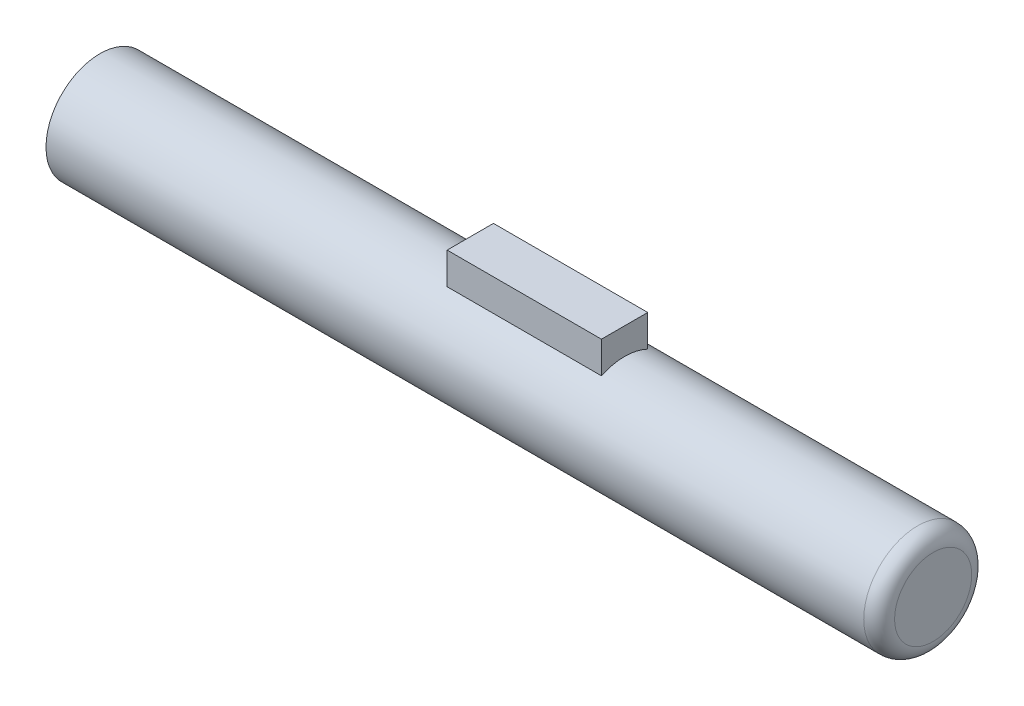
ISO-10303-21;
HEADER;
FILE_DESCRIPTION(('STEP AP214'),'2;1');
FILE_NAME('part.step','',(''),(''),'','','');
FILE_SCHEMA(('AUTOMOTIVE_DESIGN { 1 0 10303 214 1 1 1 1 }'));
ENDSEC;
DATA;
#1=APPLICATION_CONTEXT('core data for automotive mechanical design processes');
#2=APPLICATION_PROTOCOL_DEFINITION('international standard','automotive_design',2000,#1);
#3=PRODUCT_CONTEXT('',#1,'mechanical');
#4=PRODUCT('Part','Part','',(#3));
#5=PRODUCT_RELATED_PRODUCT_CATEGORY('part','',(#4));
#6=PRODUCT_DEFINITION_FORMATION('','',#4);
#7=PRODUCT_DEFINITION_CONTEXT('part definition',#1,'design');
#8=PRODUCT_DEFINITION('design','',#6,#7);
#9=PRODUCT_DEFINITION_SHAPE('','',#8);
#10=(LENGTH_UNIT() NAMED_UNIT(*) SI_UNIT(.MILLI.,.METRE.));
#11=(NAMED_UNIT(*) PLANE_ANGLE_UNIT() SI_UNIT($,.RADIAN.));
#12=(NAMED_UNIT(*) SI_UNIT($,.STERADIAN.) SOLID_ANGLE_UNIT());
#13=UNCERTAINTY_MEASURE_WITH_UNIT(LENGTH_MEASURE(1.E-05),#10,'distance_accuracy_value','');
#14=(GEOMETRIC_REPRESENTATION_CONTEXT(3) GLOBAL_UNCERTAINTY_ASSIGNED_CONTEXT((#13)) GLOBAL_UNIT_ASSIGNED_CONTEXT((#10,
#11,#12)) REPRESENTATION_CONTEXT('',''));
#15=CARTESIAN_POINT('',(0.,0.,0.));
#16=DIRECTION('',(0.,0.,1.));
#17=DIRECTION('',(1.,0.,0.));
#18=AXIS2_PLACEMENT_3D('',#15,#16,#17);
#19=CARTESIAN_POINT('',(0.,0.,0.));
#20=DIRECTION('',(-1.,0.,0.));
#21=DIRECTION('',(0.,0.,1.));
#22=AXIS2_PLACEMENT_3D('',#19,#20,#21);
#23=CYLINDRICAL_SURFACE('',#22,3.5);
#24=CARTESIAN_POINT('',(53.,0.,0.));
#25=DIRECTION('',(-1.,0.,0.));
#26=DIRECTION('',(0.,0.,1.));
#27=AXIS2_PLACEMENT_3D('',#24,#25,#26);
#28=CIRCLE('',#27,3.5);
#29=CARTESIAN_POINT('',(53.,0.,3.5));
#30=VERTEX_POINT('',#29);
#31=EDGE_CURVE('E48',#30,#30,#28,.T.);
#32=ORIENTED_EDGE('',*,*,#31,.T.);
#33=EDGE_LOOP('',(#32));
#34=FACE_BOUND('',#33,.T.);
#35=CARTESIAN_POINT('',(0.,0.,0.));
#36=DIRECTION('',(-1.,0.,0.));
#37=DIRECTION('',(0.,0.,1.));
#38=AXIS2_PLACEMENT_3D('',#35,#36,#37);
#39=CIRCLE('',#38,3.5);
#40=CARTESIAN_POINT('',(0.,0.,3.5));
#41=VERTEX_POINT('',#40);
#42=EDGE_CURVE('E127',#41,#41,#39,.T.);
#43=ORIENTED_EDGE('',*,*,#42,.F.);
#44=EDGE_LOOP('',(#43));
#45=FACE_BOUND('',#44,.T.);
#46=CARTESIAN_POINT('',(24.,0.,0.));
#47=DIRECTION('',(-1.,0.,0.));
#48=DIRECTION('',(0.,0.,-1.));
#49=AXIS2_PLACEMENT_3D('',#46,#47,#48);
#50=CIRCLE('',#49,3.5);
#51=CARTESIAN_POINT('',(24.,3.16227766016838,1.5));
#52=VERTEX_POINT('',#51);
#53=CARTESIAN_POINT('',(24.,3.16227766016838,-1.5));
#54=VERTEX_POINT('',#53);
#55=EDGE_CURVE('E85',#52,#54,#50,.T.);
#56=ORIENTED_EDGE('',*,*,#55,.T.);
#57=DIRECTION('',(1.,0.,0.));
#58=VECTOR('',#57,1.);
#59=CARTESIAN_POINT('',(24.,3.16227766016838,-1.5));
#60=LINE('',#59,#58);
#61=CARTESIAN_POINT('',(34.,3.16227766016838,-1.5));
#62=VERTEX_POINT('',#61);
#63=EDGE_CURVE('E90',#54,#62,#60,.T.);
#64=ORIENTED_EDGE('',*,*,#63,.T.);
#65=CARTESIAN_POINT('',(34.,0.,0.));
#66=DIRECTION('',(-1.,0.,0.));
#67=DIRECTION('',(0.,0.,-1.));
#68=AXIS2_PLACEMENT_3D('',#65,#66,#67);
#69=CIRCLE('',#68,3.5);
#70=CARTESIAN_POINT('',(34.,3.16227766016838,1.5));
#71=VERTEX_POINT('',#70);
#72=EDGE_CURVE('E118',#71,#62,#69,.T.);
#73=ORIENTED_EDGE('',*,*,#72,.F.);
#74=DIRECTION('',(1.,0.,0.));
#75=VECTOR('',#74,1.);
#76=CARTESIAN_POINT('',(24.,3.16227766016838,1.5));
#77=LINE('',#76,#75);
#78=EDGE_CURVE('E100',#52,#71,#77,.T.);
#79=ORIENTED_EDGE('',*,*,#78,.F.);
#80=EDGE_LOOP('',(#56,#64,#73,#79));
#81=FACE_BOUND('',#80,.T.);
#82=ADVANCED_FACE('F39',(#34,#45,#81),#23,.T.);
#83=CARTESIAN_POINT('',(0.,3.5,0.));
#84=DIRECTION('',(1.,0.,0.));
#85=DIRECTION('',(0.,0.,-1.));
#86=AXIS2_PLACEMENT_3D('',#83,#84,#85);
#87=PLANE('',#86);
#88=ORIENTED_EDGE('',*,*,#42,.T.);
#89=EDGE_LOOP('',(#88));
#90=FACE_BOUND('',#89,.T.);
#91=ADVANCED_FACE('F149',(#90),#87,.F.);
#92=CARTESIAN_POINT('',(54.,0.,0.));
#93=DIRECTION('',(-1.,0.,0.));
#94=DIRECTION('',(0.,0.,1.));
#95=AXIS2_PLACEMENT_3D('',#92,#93,#94);
#96=PLANE('',#95);
#97=CARTESIAN_POINT('',(54.,0.,0.));
#98=DIRECTION('',(-1.,0.,0.));
#99=DIRECTION('',(0.,0.,1.));
#100=AXIS2_PLACEMENT_3D('',#97,#98,#99);
#101=CIRCLE('',#100,2.5);
#102=CARTESIAN_POINT('',(54.,0.,2.5));
#103=VERTEX_POINT('',#102);
#104=EDGE_CURVE('E11',#103,#103,#101,.F.);
#105=ORIENTED_EDGE('',*,*,#104,.T.);
#106=EDGE_LOOP('',(#105));
#107=FACE_BOUND('',#106,.T.);
#108=ADVANCED_FACE('F154',(#107),#96,.F.);
#109=CARTESIAN_POINT('',(24.,5.22,1.5));
#110=DIRECTION('',(0.,0.,1.));
#111=DIRECTION('',(1.,0.,0.));
#112=AXIS2_PLACEMENT_3D('',#109,#110,#111);
#113=PLANE('',#112);
#114=DIRECTION('',(0.,-1.,0.));
#115=VECTOR('',#114,1.);
#116=CARTESIAN_POINT('',(34.,5.22,1.5));
#117=LINE('',#116,#115);
#118=CARTESIAN_POINT('',(34.,5.22,1.5));
#119=VERTEX_POINT('',#118);
#120=EDGE_CURVE('E55',#119,#71,#117,.T.);
#121=ORIENTED_EDGE('',*,*,#120,.F.);
#122=DIRECTION('',(1.,0.,0.));
#123=VECTOR('',#122,1.);
#124=CARTESIAN_POINT('',(24.,5.22,1.5));
#125=LINE('',#124,#123);
#126=CARTESIAN_POINT('',(24.,5.22,1.5));
#127=VERTEX_POINT('',#126);
#128=EDGE_CURVE('E63',#127,#119,#125,.T.);
#129=ORIENTED_EDGE('',*,*,#128,.F.);
#130=DIRECTION('',(0.,-1.,0.));
#131=VECTOR('',#130,1.);
#132=CARTESIAN_POINT('',(24.,5.22,1.5));
#133=LINE('',#132,#131);
#134=EDGE_CURVE('E108',#127,#52,#133,.T.);
#135=ORIENTED_EDGE('',*,*,#134,.T.);
#136=ORIENTED_EDGE('',*,*,#78,.T.);
#137=EDGE_LOOP('',(#121,#129,#135,#136));
#138=FACE_BOUND('',#137,.T.);
#139=ADVANCED_FACE('F158',(#138),#113,.T.);
#140=CARTESIAN_POINT('',(24.,5.22,1.5));
#141=DIRECTION('',(0.,1.,0.));
#142=DIRECTION('',(0.,0.,1.));
#143=AXIS2_PLACEMENT_3D('',#140,#141,#142);
#144=PLANE('',#143);
#145=DIRECTION('',(0.,0.,1.));
#146=VECTOR('',#145,1.);
#147=CARTESIAN_POINT('',(34.,5.22,1.5));
#148=LINE('',#147,#146);
#149=CARTESIAN_POINT('',(34.,5.22,-1.5));
#150=VERTEX_POINT('',#149);
#151=EDGE_CURVE('E111',#150,#119,#148,.T.);
#152=ORIENTED_EDGE('',*,*,#151,.F.);
#153=DIRECTION('',(1.,0.,0.));
#154=VECTOR('',#153,1.);
#155=CARTESIAN_POINT('',(24.,5.22,-1.5));
#156=LINE('',#155,#154);
#157=CARTESIAN_POINT('',(24.,5.22,-1.5));
#158=VERTEX_POINT('',#157);
#159=EDGE_CURVE('E99',#158,#150,#156,.T.);
#160=ORIENTED_EDGE('',*,*,#159,.F.);
#161=DIRECTION('',(0.,0.,1.));
#162=VECTOR('',#161,1.);
#163=CARTESIAN_POINT('',(24.,5.22,1.5));
#164=LINE('',#163,#162);
#165=EDGE_CURVE('E103',#158,#127,#164,.T.);
#166=ORIENTED_EDGE('',*,*,#165,.T.);
#167=ORIENTED_EDGE('',*,*,#128,.T.);
#168=EDGE_LOOP('',(#152,#160,#166,#167));
#169=FACE_BOUND('',#168,.T.);
#170=ADVANCED_FACE('F165',(#169),#144,.T.);
#171=CARTESIAN_POINT('',(24.,5.22,-1.5));
#172=DIRECTION('',(0.,0.,-1.));
#173=DIRECTION('',(-1.,0.,0.));
#174=AXIS2_PLACEMENT_3D('',#171,#172,#173);
#175=PLANE('',#174);
#176=DIRECTION('',(0.,1.,0.));
#177=VECTOR('',#176,1.);
#178=CARTESIAN_POINT('',(34.,5.22,-1.5));
#179=LINE('',#178,#177);
#180=EDGE_CURVE('E95',#62,#150,#179,.T.);
#181=ORIENTED_EDGE('',*,*,#180,.F.);
#182=ORIENTED_EDGE('',*,*,#63,.F.);
#183=DIRECTION('',(0.,1.,0.));
#184=VECTOR('',#183,1.);
#185=CARTESIAN_POINT('',(24.,5.22,-1.5));
#186=LINE('',#185,#184);
#187=EDGE_CURVE('E92',#54,#158,#186,.T.);
#188=ORIENTED_EDGE('',*,*,#187,.T.);
#189=ORIENTED_EDGE('',*,*,#159,.T.);
#190=EDGE_LOOP('',(#181,#182,#188,#189));
#191=FACE_BOUND('',#190,.T.);
#192=ADVANCED_FACE('F91',(#191),#175,.T.);
#193=CARTESIAN_POINT('',(24.,0.,0.));
#194=DIRECTION('',(1.,0.,0.));
#195=DIRECTION('',(0.,0.,-1.));
#196=AXIS2_PLACEMENT_3D('',#193,#194,#195);
#197=PLANE('',#196);
#198=ORIENTED_EDGE('',*,*,#134,.F.);
#199=ORIENTED_EDGE('',*,*,#165,.F.);
#200=ORIENTED_EDGE('',*,*,#187,.F.);
#201=ORIENTED_EDGE('',*,*,#55,.F.);
#202=EDGE_LOOP('',(#198,#199,#200,#201));
#203=FACE_BOUND('',#202,.T.);
#204=ADVANCED_FACE('F102',(#203),#197,.F.);
#205=CARTESIAN_POINT('',(34.,0.,0.));
#206=DIRECTION('',(1.,0.,0.));
#207=DIRECTION('',(0.,0.,-1.));
#208=AXIS2_PLACEMENT_3D('',#205,#206,#207);
#209=PLANE('',#208);
#210=ORIENTED_EDGE('',*,*,#120,.T.);
#211=ORIENTED_EDGE('',*,*,#72,.T.);
#212=ORIENTED_EDGE('',*,*,#180,.T.);
#213=ORIENTED_EDGE('',*,*,#151,.T.);
#214=EDGE_LOOP('',(#210,#211,#212,#213));
#215=FACE_BOUND('',#214,.T.);
#216=ADVANCED_FACE('F141',(#215),#209,.T.);
#217=CARTESIAN_POINT('',(53.,0.,0.));
#218=DIRECTION('',(-1.,0.,0.));
#219=DIRECTION('',(0.,0.,1.));
#220=AXIS2_PLACEMENT_3D('',#217,#218,#219);
#221=TOROIDAL_SURFACE('',#220,2.5,1.);
#222=ORIENTED_EDGE('',*,*,#104,.F.);
#223=EDGE_LOOP('',(#222));
#224=FACE_BOUND('',#223,.T.);
#225=ORIENTED_EDGE('',*,*,#31,.F.);
#226=EDGE_LOOP('',(#225));
#227=FACE_BOUND('',#226,.T.);
#228=ADVANCED_FACE('F41',(#224,#227),#221,.T.);
#229=CLOSED_SHELL('',(#82,#91,#108,#139,#170,#192,#204,#216,#228));
#230=MANIFOLD_SOLID_BREP('B2',#229);
#231=ADVANCED_BREP_SHAPE_REPRESENTATION('',(#18,#230),#14);
#232=SHAPE_DEFINITION_REPRESENTATION(#9,#231);
ENDSEC;
END-ISO-10303-21;
